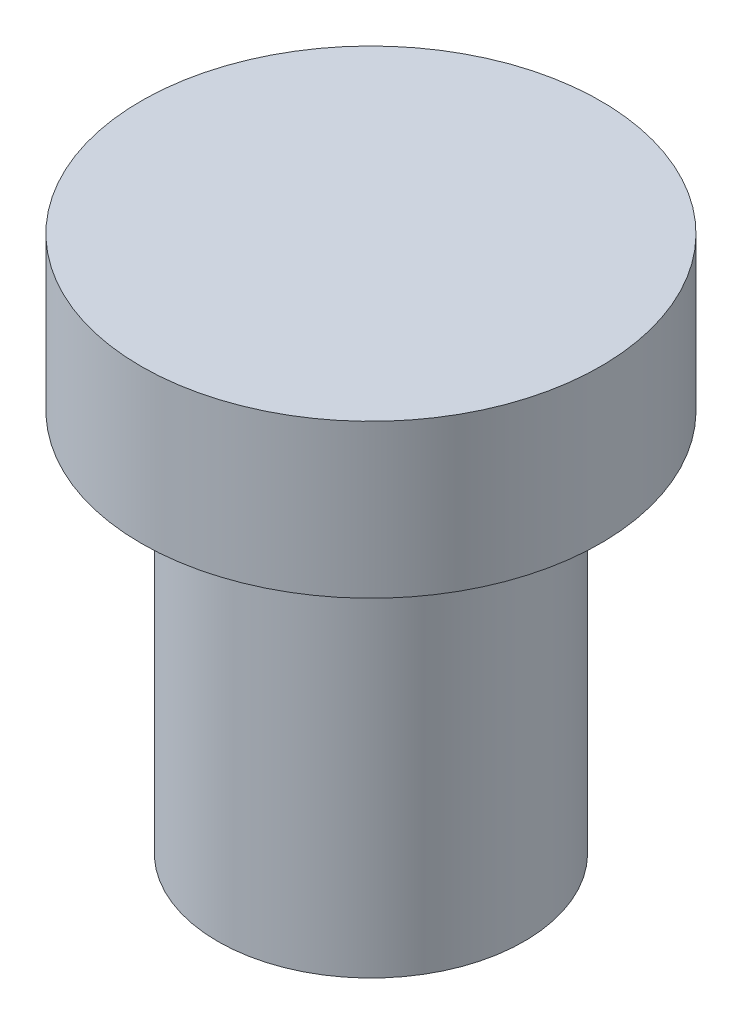
ISO-10303-21;
HEADER;
FILE_DESCRIPTION(('STEP AP214'),'2;1');
FILE_NAME('part.step','',(''),(''),'','','');
FILE_SCHEMA(('AUTOMOTIVE_DESIGN { 1 0 10303 214 1 1 1 1 }'));
ENDSEC;
DATA;
#1=APPLICATION_CONTEXT('core data for automotive mechanical design processes');
#2=APPLICATION_PROTOCOL_DEFINITION('international standard','automotive_design',2000,#1);
#3=PRODUCT_CONTEXT('',#1,'mechanical');
#4=PRODUCT('Part','Part','',(#3));
#5=PRODUCT_RELATED_PRODUCT_CATEGORY('part','',(#4));
#6=PRODUCT_DEFINITION_FORMATION('','',#4);
#7=PRODUCT_DEFINITION_CONTEXT('part definition',#1,'design');
#8=PRODUCT_DEFINITION('design','',#6,#7);
#9=PRODUCT_DEFINITION_SHAPE('','',#8);
#10=(LENGTH_UNIT() NAMED_UNIT(*) SI_UNIT(.MILLI.,.METRE.));
#11=(NAMED_UNIT(*) PLANE_ANGLE_UNIT() SI_UNIT($,.RADIAN.));
#12=(NAMED_UNIT(*) SI_UNIT($,.STERADIAN.) SOLID_ANGLE_UNIT());
#13=UNCERTAINTY_MEASURE_WITH_UNIT(LENGTH_MEASURE(1.E-05),#10,'distance_accuracy_value','');
#14=(GEOMETRIC_REPRESENTATION_CONTEXT(3) GLOBAL_UNCERTAINTY_ASSIGNED_CONTEXT((#13)) GLOBAL_UNIT_ASSIGNED_CONTEXT((#10,
#11,#12)) REPRESENTATION_CONTEXT('',''));
#15=CARTESIAN_POINT('',(0.,0.,0.));
#16=DIRECTION('',(0.,0.,1.));
#17=DIRECTION('',(1.,0.,0.));
#18=AXIS2_PLACEMENT_3D('',#15,#16,#17);
#19=CARTESIAN_POINT('',(0.,16.2461809726681,0.));
#20=DIRECTION('',(0.,-1.,0.));
#21=DIRECTION('',(0.,0.,-1.));
#22=AXIS2_PLACEMENT_3D('',#19,#20,#21);
#23=PLANE('',#22);
#24=CARTESIAN_POINT('',(0.,16.2461809726681,0.));
#25=DIRECTION('',(0.,1.,0.));
#26=DIRECTION('',(0.,0.,1.));
#27=AXIS2_PLACEMENT_3D('',#24,#25,#26);
#28=CIRCLE('',#27,3.);
#29=CARTESIAN_POINT('',(0.,16.2461809726681,3.));
#30=VERTEX_POINT('',#29);
#31=EDGE_CURVE('E10',#30,#30,#28,.T.);
#32=ORIENTED_EDGE('',*,*,#31,.T.);
#33=EDGE_LOOP('',(#32));
#34=FACE_BOUND('',#33,.T.);
#35=ADVANCED_FACE('F30',(#34),#23,.F.);
#36=CARTESIAN_POINT('',(0.,20.9904826455237,0.));
#37=DIRECTION('',(0.,1.,0.));
#38=DIRECTION('',(0.,0.,1.));
#39=AXIS2_PLACEMENT_3D('',#36,#37,#38);
#40=CYLINDRICAL_SURFACE('',#39,3.);
#41=ORIENTED_EDGE('',*,*,#31,.F.);
#42=EDGE_LOOP('',(#41));
#43=FACE_BOUND('',#42,.T.);
#44=CARTESIAN_POINT('',(0.,14.2461809726681,0.));
#45=DIRECTION('',(0.,1.,0.));
#46=DIRECTION('',(0.,0.,1.));
#47=AXIS2_PLACEMENT_3D('',#44,#45,#46);
#48=CIRCLE('',#47,3.);
#49=CARTESIAN_POINT('',(0.,14.2461809726681,3.));
#50=VERTEX_POINT('',#49);
#51=EDGE_CURVE('E36',#50,#50,#48,.T.);
#52=ORIENTED_EDGE('',*,*,#51,.T.);
#53=EDGE_LOOP('',(#52));
#54=FACE_BOUND('',#53,.T.);
#55=ADVANCED_FACE('F62',(#43,#54),#40,.T.);
#56=CARTESIAN_POINT('',(0.,14.2461809726681,-3.));
#57=DIRECTION('',(0.,1.,0.));
#58=DIRECTION('',(0.,0.,1.));
#59=AXIS2_PLACEMENT_3D('',#56,#57,#58);
#60=PLANE('',#59);
#61=ORIENTED_EDGE('',*,*,#51,.F.);
#62=EDGE_LOOP('',(#61));
#63=FACE_BOUND('',#62,.T.);
#64=CARTESIAN_POINT('',(0.,14.2461809726681,0.));
#65=DIRECTION('',(0.,1.,0.));
#66=DIRECTION('',(0.,0.,1.));
#67=AXIS2_PLACEMENT_3D('',#64,#65,#66);
#68=CIRCLE('',#67,1.99999999999999);
#69=CARTESIAN_POINT('',(0.,14.2461809726681,1.99999999999999));
#70=VERTEX_POINT('',#69);
#71=EDGE_CURVE('E40',#70,#70,#68,.T.);
#72=ORIENTED_EDGE('',*,*,#71,.T.);
#73=EDGE_LOOP('',(#72));
#74=FACE_BOUND('',#73,.T.);
#75=ADVANCED_FACE('F58',(#63,#74),#60,.F.);
#76=CARTESIAN_POINT('',(0.,20.9904826455237,0.));
#77=DIRECTION('',(0.,1.,0.));
#78=DIRECTION('',(0.,0.,1.));
#79=AXIS2_PLACEMENT_3D('',#76,#77,#78);
#80=CYLINDRICAL_SURFACE('',#79,2.);
#81=ORIENTED_EDGE('',*,*,#71,.F.);
#82=EDGE_LOOP('',(#81));
#83=FACE_BOUND('',#82,.T.);
#84=CARTESIAN_POINT('',(0.,9.24618097266808,0.));
#85=DIRECTION('',(0.,1.,0.));
#86=DIRECTION('',(0.,0.,1.));
#87=AXIS2_PLACEMENT_3D('',#84,#85,#86);
#88=CIRCLE('',#87,2.);
#89=CARTESIAN_POINT('',(0.,9.24618097266808,2.));
#90=VERTEX_POINT('',#89);
#91=EDGE_CURVE('E44',#90,#90,#88,.T.);
#92=ORIENTED_EDGE('',*,*,#91,.T.);
#93=EDGE_LOOP('',(#92));
#94=FACE_BOUND('',#93,.T.);
#95=ADVANCED_FACE('F50',(#83,#94),#80,.T.);
#96=CARTESIAN_POINT('',(0.,9.24618097266808,-2.));
#97=DIRECTION('',(0.,1.,0.));
#98=DIRECTION('',(0.,0.,1.));
#99=AXIS2_PLACEMENT_3D('',#96,#97,#98);
#100=PLANE('',#99);
#101=ORIENTED_EDGE('',*,*,#91,.F.);
#102=EDGE_LOOP('',(#101));
#103=FACE_BOUND('',#102,.T.);
#104=ADVANCED_FACE('F52',(#103),#100,.F.);
#105=CLOSED_SHELL('',(#35,#55,#75,#95,#104));
#106=MANIFOLD_SOLID_BREP('B2',#105);
#107=ADVANCED_BREP_SHAPE_REPRESENTATION('',(#18,#106),#14);
#108=SHAPE_DEFINITION_REPRESENTATION(#9,#107);
ENDSEC;
END-ISO-10303-21;
